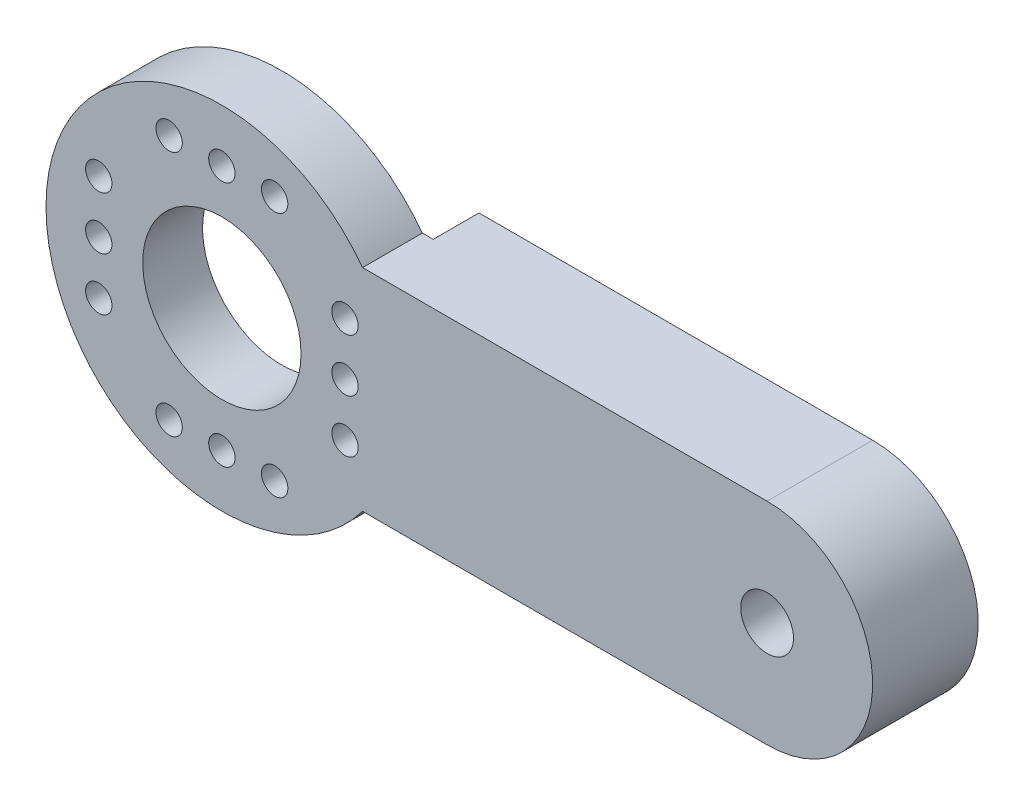
ISO-10303-21;
HEADER;
FILE_DESCRIPTION(('STEP AP214'),'2;1');
FILE_NAME('part.step','',(''),(''),'','','');
FILE_SCHEMA(('AUTOMOTIVE_DESIGN { 1 0 10303 214 1 1 1 1 }'));
ENDSEC;
DATA;
#1=APPLICATION_CONTEXT('core data for automotive mechanical design processes');
#2=APPLICATION_PROTOCOL_DEFINITION('international standard','automotive_design',2000,#1);
#3=PRODUCT_CONTEXT('',#1,'mechanical');
#4=PRODUCT('Part','Part','',(#3));
#5=PRODUCT_RELATED_PRODUCT_CATEGORY('part','',(#4));
#6=PRODUCT_DEFINITION_FORMATION('','',#4);
#7=PRODUCT_DEFINITION_CONTEXT('part definition',#1,'design');
#8=PRODUCT_DEFINITION('design','',#6,#7);
#9=PRODUCT_DEFINITION_SHAPE('','',#8);
#10=(LENGTH_UNIT() NAMED_UNIT(*) SI_UNIT(.MILLI.,.METRE.));
#11=(NAMED_UNIT(*) PLANE_ANGLE_UNIT() SI_UNIT($,.RADIAN.));
#12=(NAMED_UNIT(*) SI_UNIT($,.STERADIAN.) SOLID_ANGLE_UNIT());
#13=UNCERTAINTY_MEASURE_WITH_UNIT(LENGTH_MEASURE(1.E-05),#10,'distance_accuracy_value','');
#14=(GEOMETRIC_REPRESENTATION_CONTEXT(3) GLOBAL_UNCERTAINTY_ASSIGNED_CONTEXT((#13)) GLOBAL_UNIT_ASSIGNED_CONTEXT((#10,
#11,#12)) REPRESENTATION_CONTEXT('',''));
#15=CARTESIAN_POINT('',(0.,0.,0.));
#16=DIRECTION('',(0.,0.,1.));
#17=DIRECTION('',(1.,0.,0.));
#18=AXIS2_PLACEMENT_3D('',#15,#16,#17);
#19=CARTESIAN_POINT('',(0.,-77.386258364001,-6.));
#20=DIRECTION('',(0.,1.,0.));
#21=DIRECTION('',(-1.,0.,0.));
#22=AXIS2_PLACEMENT_3D('',#19,#20,#21);
#23=PLANE('',#22);
#24=DIRECTION('',(0.,0.,1.));
#25=VECTOR('',#24,1.);
#26=CARTESIAN_POINT('',(-4.43390628821608,-77.386258364001,-15.5));
#27=LINE('',#26,#25);
#28=CARTESIAN_POINT('',(-4.43390628821608,-77.386258364001,-6.));
#29=VERTEX_POINT('',#28);
#30=CARTESIAN_POINT('',(-4.43390628821608,-77.386258364001,-3.40000000000027));
#31=VERTEX_POINT('',#30);
#32=EDGE_CURVE('E118',#29,#31,#27,.T.);
#33=ORIENTED_EDGE('',*,*,#32,.F.);
#34=DIRECTION('',(-1.,0.,0.));
#35=VECTOR('',#34,1.);
#36=CARTESIAN_POINT('',(0.,-77.386258364001,-6.));
#37=LINE('',#36,#35);
#38=CARTESIAN_POINT('',(17.9492497419931,-77.386258364001,-6.));
#39=VERTEX_POINT('',#38);
#40=EDGE_CURVE('E84',#39,#29,#37,.T.);
#41=ORIENTED_EDGE('',*,*,#40,.F.);
#42=DIRECTION('',(0.,0.,1.));
#43=VECTOR('',#42,1.);
#44=CARTESIAN_POINT('',(17.9492497419931,-77.386258364001,-6.));
#45=LINE('',#44,#43);
#46=CARTESIAN_POINT('',(17.9492497419931,-77.386258364001,0.));
#47=VERTEX_POINT('',#46);
#48=EDGE_CURVE('E60',#39,#47,#45,.T.);
#49=ORIENTED_EDGE('',*,*,#48,.T.);
#50=DIRECTION('',(-1.,0.,0.));
#51=VECTOR('',#50,1.);
#52=CARTESIAN_POINT('',(0.,-77.386258364001,0.));
#53=LINE('',#52,#51);
#54=CARTESIAN_POINT('',(-5.05075025800691,-77.386258364001,0.));
#55=VERTEX_POINT('',#54);
#56=EDGE_CURVE('E81',#47,#55,#53,.T.);
#57=ORIENTED_EDGE('',*,*,#56,.T.);
#58=DIRECTION('',(0.,0.,1.));
#59=VECTOR('',#58,1.);
#60=CARTESIAN_POINT('',(-5.05075025800691,-77.386258364001,-6.));
#61=LINE('',#60,#59);
#62=CARTESIAN_POINT('',(-5.0507502580004,-77.3862583640059,-3.40000000000027));
#63=VERTEX_POINT('',#62);
#64=EDGE_CURVE('E86',#63,#55,#61,.T.);
#65=ORIENTED_EDGE('',*,*,#64,.F.);
#66=DIRECTION('',(1.,0.,0.));
#67=VECTOR('',#66,1.);
#68=CARTESIAN_POINT('',(0.,-77.386258364001,-3.40000000000027));
#69=LINE('',#68,#67);
#70=EDGE_CURVE('E126',#63,#31,#69,.T.);
#71=ORIENTED_EDGE('',*,*,#70,.T.);
#72=EDGE_LOOP('',(#33,#41,#49,#57,#65,#71));
#73=FACE_BOUND('',#72,.T.);
#74=ADVANCED_FACE('F36',(#73),#23,.F.);
#75=CARTESIAN_POINT('',(0.,-65.386258364001,-6.));
#76=DIRECTION('',(0.,-1.,0.));
#77=DIRECTION('',(1.,0.,0.));
#78=AXIS2_PLACEMENT_3D('',#75,#76,#77);
#79=PLANE('',#78);
#80=DIRECTION('',(0.,0.,1.));
#81=VECTOR('',#80,1.);
#82=CARTESIAN_POINT('',(-4.43390628823496,-65.386258364001,-15.5));
#83=LINE('',#82,#81);
#84=CARTESIAN_POINT('',(-4.43390628823497,-65.386258364001,-3.40000000000025));
#85=VERTEX_POINT('',#84);
#86=CARTESIAN_POINT('',(-4.43390628823497,-65.386258364001,-6.));
#87=VERTEX_POINT('',#86);
#88=EDGE_CURVE('E51',#85,#87,#83,.F.);
#89=ORIENTED_EDGE('',*,*,#88,.F.);
#90=DIRECTION('',(-1.,0.,0.));
#91=VECTOR('',#90,1.);
#92=CARTESIAN_POINT('',(0.,-65.386258364001,-3.40000000000025));
#93=LINE('',#92,#91);
#94=CARTESIAN_POINT('',(-5.05075025800691,-65.386258364001,-3.40000000000025));
#95=VERTEX_POINT('',#94);
#96=EDGE_CURVE('E11',#85,#95,#93,.T.);
#97=ORIENTED_EDGE('',*,*,#96,.T.);
#98=DIRECTION('',(0.,0.,1.));
#99=VECTOR('',#98,1.);
#100=CARTESIAN_POINT('',(-5.05075025800691,-65.386258364001,-6.));
#101=LINE('',#100,#99);
#102=CARTESIAN_POINT('',(-5.05075025800691,-65.386258364001,0.));
#103=VERTEX_POINT('',#102);
#104=EDGE_CURVE('E112',#95,#103,#101,.T.);
#105=ORIENTED_EDGE('',*,*,#104,.T.);
#106=DIRECTION('',(1.,0.,0.));
#107=VECTOR('',#106,1.);
#108=CARTESIAN_POINT('',(0.,-65.386258364001,0.));
#109=LINE('',#108,#107);
#110=CARTESIAN_POINT('',(17.9492497419931,-65.386258364001,0.));
#111=VERTEX_POINT('',#110);
#112=EDGE_CURVE('E100',#103,#111,#109,.T.);
#113=ORIENTED_EDGE('',*,*,#112,.T.);
#114=DIRECTION('',(0.,0.,1.));
#115=VECTOR('',#114,1.);
#116=CARTESIAN_POINT('',(17.9492497419931,-65.386258364001,-6.));
#117=LINE('',#116,#115);
#118=CARTESIAN_POINT('',(17.9492497419931,-65.386258364001,-6.));
#119=VERTEX_POINT('',#118);
#120=EDGE_CURVE('E98',#119,#111,#117,.T.);
#121=ORIENTED_EDGE('',*,*,#120,.F.);
#122=DIRECTION('',(1.,0.,0.));
#123=VECTOR('',#122,1.);
#124=CARTESIAN_POINT('',(0.,-65.386258364001,-6.));
#125=LINE('',#124,#123);
#126=EDGE_CURVE('E131',#87,#119,#125,.T.);
#127=ORIENTED_EDGE('',*,*,#126,.F.);
#128=EDGE_LOOP('',(#89,#97,#105,#113,#121,#127));
#129=FACE_BOUND('',#128,.T.);
#130=ADVANCED_FACE('F259',(#129),#79,.F.);
#131=CARTESIAN_POINT('',(17.9492497419931,-71.386258364001,-6.));
#132=DIRECTION('',(0.,0.,1.));
#133=DIRECTION('',(1.,0.,0.));
#134=AXIS2_PLACEMENT_3D('',#131,#132,#133);
#135=CYLINDRICAL_SURFACE('',#134,6.00000000000002);
#136=CARTESIAN_POINT('',(17.9492497419931,-71.386258364001,0.));
#137=DIRECTION('',(0.,0.,1.));
#138=DIRECTION('',(1.,0.,0.));
#139=AXIS2_PLACEMENT_3D('',#136,#137,#138);
#140=CIRCLE('',#139,6.00000000000002);
#141=EDGE_CURVE('E92',#47,#111,#140,.T.);
#142=ORIENTED_EDGE('',*,*,#141,.F.);
#143=ORIENTED_EDGE('',*,*,#48,.F.);
#144=CARTESIAN_POINT('',(17.9492497419931,-71.386258364001,-6.));
#145=DIRECTION('',(0.,0.,1.));
#146=DIRECTION('',(1.,0.,0.));
#147=AXIS2_PLACEMENT_3D('',#144,#145,#146);
#148=CIRCLE('',#147,6.00000000000002);
#149=EDGE_CURVE('E95',#39,#119,#148,.T.);
#150=ORIENTED_EDGE('',*,*,#149,.T.);
#151=ORIENTED_EDGE('',*,*,#120,.T.);
#152=EDGE_LOOP('',(#142,#143,#150,#151));
#153=FACE_BOUND('',#152,.T.);
#154=ADVANCED_FACE('F38',(#153),#135,.T.);
#155=CARTESIAN_POINT('',(-13.0507502580171,-71.3862583640146,-6.));
#156=DIRECTION('',(0.,0.,1.));
#157=DIRECTION('',(1.,0.,0.));
#158=AXIS2_PLACEMENT_3D('',#155,#156,#157);
#159=CYLINDRICAL_SURFACE('',#158,10.0000000000081);
#160=CARTESIAN_POINT('',(-13.0507502580171,-71.3862583640146,-3.40000000000026));
#161=DIRECTION('',(0.,0.,1.));
#162=DIRECTION('',(0.,-1.,0.));
#163=AXIS2_PLACEMENT_3D('',#160,#161,#162);
#164=CIRCLE('',#163,10.0000000000081);
#165=EDGE_CURVE('E127',#63,#95,#164,.F.);
#166=ORIENTED_EDGE('',*,*,#165,.F.);
#167=ORIENTED_EDGE('',*,*,#64,.T.);
#168=CARTESIAN_POINT('',(-13.0507502580171,-71.3862583640146,0.));
#169=DIRECTION('',(0.,0.,1.));
#170=DIRECTION('',(1.,0.,0.));
#171=AXIS2_PLACEMENT_3D('',#168,#169,#170);
#172=CIRCLE('',#171,10.0000000000081);
#173=EDGE_CURVE('E94',#103,#55,#172,.T.);
#174=ORIENTED_EDGE('',*,*,#173,.F.);
#175=ORIENTED_EDGE('',*,*,#104,.F.);
#176=EDGE_LOOP('',(#166,#167,#174,#175));
#177=FACE_BOUND('',#176,.T.);
#178=ADVANCED_FACE('F260',(#177),#159,.T.);
#179=CARTESIAN_POINT('',(0.,0.,-6.));
#180=DIRECTION('',(0.,0.,1.));
#181=DIRECTION('',(1.,0.,0.));
#182=AXIS2_PLACEMENT_3D('',#179,#180,#181);
#183=PLANE('',#182);
#184=CARTESIAN_POINT('',(-13.0507502580171,-71.3862583640146,-6.));
#185=DIRECTION('',(0.,0.,1.));
#186=DIRECTION('',(1.,0.,0.));
#187=AXIS2_PLACEMENT_3D('',#184,#185,#186);
#188=CIRCLE('',#187,10.4999999999873);
#189=EDGE_CURVE('E44',#87,#29,#188,.F.);
#190=ORIENTED_EDGE('',*,*,#189,.F.);
#191=ORIENTED_EDGE('',*,*,#126,.T.);
#192=ORIENTED_EDGE('',*,*,#149,.F.);
#193=ORIENTED_EDGE('',*,*,#40,.T.);
#194=EDGE_LOOP('',(#190,#191,#192,#193));
#195=FACE_BOUND('',#194,.T.);
#196=CARTESIAN_POINT('',(17.9492497419931,-71.386258364001,-6.));
#197=DIRECTION('',(0.,0.,1.));
#198=DIRECTION('',(1.,0.,0.));
#199=AXIS2_PLACEMENT_3D('',#196,#197,#198);
#200=CIRCLE('',#199,1.50000000000001);
#201=CARTESIAN_POINT('',(19.4492497419931,-71.386258364001,-6.));
#202=VERTEX_POINT('',#201);
#203=EDGE_CURVE('E101',#202,#202,#200,.T.);
#204=ORIENTED_EDGE('',*,*,#203,.T.);
#205=EDGE_LOOP('',(#204));
#206=FACE_BOUND('',#205,.T.);
#207=ADVANCED_FACE('F129',(#195,#206),#183,.F.);
#208=CARTESIAN_POINT('',(0.,0.,0.));
#209=DIRECTION('',(0.,0.,1.));
#210=DIRECTION('',(1.,0.,0.));
#211=AXIS2_PLACEMENT_3D('',#208,#209,#210);
#212=PLANE('',#211);
#213=CARTESIAN_POINT('',(-13.0507502580171,-71.3862583640146,0.));
#214=DIRECTION('',(0.,0.,1.));
#215=DIRECTION('',(1.,0.,0.));
#216=AXIS2_PLACEMENT_3D('',#213,#214,#215);
#217=CIRCLE('',#216,4.5);
#218=CARTESIAN_POINT('',(-8.55075025801707,-71.3862583640146,0.));
#219=VERTEX_POINT('',#218);
#220=EDGE_CURVE('E186',#219,#219,#217,.T.);
#221=ORIENTED_EDGE('',*,*,#220,.F.);
#222=EDGE_LOOP('',(#221));
#223=FACE_BOUND('',#222,.T.);
#224=CARTESIAN_POINT('',(-16.0507502579993,-64.3862583640001,0.));
#225=DIRECTION('',(0.,0.,1.));
#226=DIRECTION('',(1.,0.,0.));
#227=AXIS2_PLACEMENT_3D('',#224,#225,#226);
#228=CIRCLE('',#227,0.749999999999999);
#229=CARTESIAN_POINT('',(-15.3007502579993,-64.3862583640001,0.));
#230=VERTEX_POINT('',#229);
#231=EDGE_CURVE('E142',#230,#230,#228,.T.);
#232=ORIENTED_EDGE('',*,*,#231,.F.);
#233=EDGE_LOOP('',(#232));
#234=FACE_BOUND('',#233,.T.);
#235=CARTESIAN_POINT('',(-10.0507502579993,-64.3862583640001,0.));
#236=DIRECTION('',(0.,0.,1.));
#237=DIRECTION('',(1.,0.,0.));
#238=AXIS2_PLACEMENT_3D('',#235,#236,#237);
#239=CIRCLE('',#238,0.749999999999999);
#240=CARTESIAN_POINT('',(-9.30075025799929,-64.3862583640001,0.));
#241=VERTEX_POINT('',#240);
#242=EDGE_CURVE('E145',#241,#241,#239,.T.);
#243=ORIENTED_EDGE('',*,*,#242,.F.);
#244=EDGE_LOOP('',(#243));
#245=FACE_BOUND('',#244,.T.);
#246=CARTESIAN_POINT('',(-13.0507502579993,-64.3862583640001,0.));
#247=DIRECTION('',(0.,0.,1.));
#248=DIRECTION('',(1.,0.,0.));
#249=AXIS2_PLACEMENT_3D('',#246,#247,#248);
#250=CIRCLE('',#249,0.749999999999999);
#251=CARTESIAN_POINT('',(-12.3007502579993,-64.3862583640001,0.));
#252=VERTEX_POINT('',#251);
#253=EDGE_CURVE('E148',#252,#252,#250,.T.);
#254=ORIENTED_EDGE('',*,*,#253,.F.);
#255=EDGE_LOOP('',(#254));
#256=FACE_BOUND('',#255,.T.);
#257=CARTESIAN_POINT('',(-6.05075025799934,-74.3862583640001,0.));
#258=DIRECTION('',(0.,0.,1.));
#259=DIRECTION('',(1.,0.,0.));
#260=AXIS2_PLACEMENT_3D('',#257,#258,#259);
#261=CIRCLE('',#260,0.750000000000003);
#262=CARTESIAN_POINT('',(-5.30075025799934,-74.3862583640001,0.));
#263=VERTEX_POINT('',#262);
#264=EDGE_CURVE('E151',#263,#263,#261,.T.);
#265=ORIENTED_EDGE('',*,*,#264,.F.);
#266=EDGE_LOOP('',(#265));
#267=FACE_BOUND('',#266,.T.);
#268=CARTESIAN_POINT('',(-6.05075025799935,-68.3862583640001,0.));
#269=DIRECTION('',(0.,0.,1.));
#270=DIRECTION('',(1.,0.,0.));
#271=AXIS2_PLACEMENT_3D('',#268,#269,#270);
#272=CIRCLE('',#271,0.749999999999999);
#273=CARTESIAN_POINT('',(-5.30075025799935,-68.3862583640001,0.));
#274=VERTEX_POINT('',#273);
#275=EDGE_CURVE('E154',#274,#274,#272,.T.);
#276=ORIENTED_EDGE('',*,*,#275,.F.);
#277=EDGE_LOOP('',(#276));
#278=FACE_BOUND('',#277,.T.);
#279=CARTESIAN_POINT('',(-13.0507502579993,-78.3862583640001,0.));
#280=DIRECTION('',(0.,0.,1.));
#281=DIRECTION('',(1.,0.,0.));
#282=AXIS2_PLACEMENT_3D('',#279,#280,#281);
#283=CIRCLE('',#282,0.750000000000012);
#284=CARTESIAN_POINT('',(-12.3007502579993,-78.3862583640001,0.));
#285=VERTEX_POINT('',#284);
#286=EDGE_CURVE('E157',#285,#285,#283,.T.);
#287=ORIENTED_EDGE('',*,*,#286,.F.);
#288=EDGE_LOOP('',(#287));
#289=FACE_BOUND('',#288,.T.);
#290=CARTESIAN_POINT('',(-16.0507502579993,-78.3862583640001,0.));
#291=DIRECTION('',(0.,0.,1.));
#292=DIRECTION('',(1.,0.,0.));
#293=AXIS2_PLACEMENT_3D('',#290,#291,#292);
#294=CIRCLE('',#293,0.749999999999999);
#295=CARTESIAN_POINT('',(-15.3007502579993,-78.3862583640001,0.));
#296=VERTEX_POINT('',#295);
#297=EDGE_CURVE('E160',#296,#296,#294,.T.);
#298=ORIENTED_EDGE('',*,*,#297,.F.);
#299=EDGE_LOOP('',(#298));
#300=FACE_BOUND('',#299,.T.);
#301=CARTESIAN_POINT('',(-20.0507502579994,-74.3862583640001,0.));
#302=DIRECTION('',(0.,0.,1.));
#303=DIRECTION('',(1.,0.,0.));
#304=AXIS2_PLACEMENT_3D('',#301,#302,#303);
#305=CIRCLE('',#304,0.749999999999999);
#306=CARTESIAN_POINT('',(-19.3007502579994,-74.3862583640001,0.));
#307=VERTEX_POINT('',#306);
#308=EDGE_CURVE('E163',#307,#307,#305,.T.);
#309=ORIENTED_EDGE('',*,*,#308,.F.);
#310=EDGE_LOOP('',(#309));
#311=FACE_BOUND('',#310,.T.);
#312=CARTESIAN_POINT('',(-20.0507502579993,-68.3862583640001,0.));
#313=DIRECTION('',(0.,0.,1.));
#314=DIRECTION('',(1.,0.,0.));
#315=AXIS2_PLACEMENT_3D('',#312,#313,#314);
#316=CIRCLE('',#315,0.749999999999999);
#317=CARTESIAN_POINT('',(-19.3007502579993,-68.3862583640001,0.));
#318=VERTEX_POINT('',#317);
#319=EDGE_CURVE('E166',#318,#318,#316,.T.);
#320=ORIENTED_EDGE('',*,*,#319,.F.);
#321=EDGE_LOOP('',(#320));
#322=FACE_BOUND('',#321,.T.);
#323=CARTESIAN_POINT('',(-20.0507502579994,-71.3862583640001,0.));
#324=DIRECTION('',(0.,0.,1.));
#325=DIRECTION('',(1.,0.,0.));
#326=AXIS2_PLACEMENT_3D('',#323,#324,#325);
#327=CIRCLE('',#326,0.749999999999999);
#328=CARTESIAN_POINT('',(-19.3007502579994,-71.3862583640001,0.));
#329=VERTEX_POINT('',#328);
#330=EDGE_CURVE('E169',#329,#329,#327,.T.);
#331=ORIENTED_EDGE('',*,*,#330,.F.);
#332=EDGE_LOOP('',(#331));
#333=FACE_BOUND('',#332,.T.);
#334=CARTESIAN_POINT('',(-10.0507502579993,-78.3862583640001,0.));
#335=DIRECTION('',(0.,0.,1.));
#336=DIRECTION('',(1.,0.,0.));
#337=AXIS2_PLACEMENT_3D('',#334,#335,#336);
#338=CIRCLE('',#337,0.749999999999999);
#339=CARTESIAN_POINT('',(-9.30075025799934,-78.3862583640001,0.));
#340=VERTEX_POINT('',#339);
#341=EDGE_CURVE('E172',#340,#340,#338,.T.);
#342=ORIENTED_EDGE('',*,*,#341,.F.);
#343=EDGE_LOOP('',(#342));
#344=FACE_BOUND('',#343,.T.);
#345=CARTESIAN_POINT('',(-6.05075025799934,-71.3862583640001,0.));
#346=DIRECTION('',(0.,0.,1.));
#347=DIRECTION('',(1.,0.,0.));
#348=AXIS2_PLACEMENT_3D('',#345,#346,#347);
#349=CIRCLE('',#348,0.75);
#350=CARTESIAN_POINT('',(-5.30075025799934,-71.3862583640001,0.));
#351=VERTEX_POINT('',#350);
#352=EDGE_CURVE('E175',#351,#351,#349,.T.);
#353=ORIENTED_EDGE('',*,*,#352,.F.);
#354=EDGE_LOOP('',(#353));
#355=FACE_BOUND('',#354,.T.);
#356=CARTESIAN_POINT('',(17.9492497419931,-71.386258364001,0.));
#357=DIRECTION('',(0.,0.,1.));
#358=DIRECTION('',(1.,0.,0.));
#359=AXIS2_PLACEMENT_3D('',#356,#357,#358);
#360=CIRCLE('',#359,1.50000000000001);
#361=CARTESIAN_POINT('',(19.4492497419931,-71.386258364001,0.));
#362=VERTEX_POINT('',#361);
#363=EDGE_CURVE('E105',#362,#362,#360,.T.);
#364=ORIENTED_EDGE('',*,*,#363,.F.);
#365=EDGE_LOOP('',(#364));
#366=FACE_BOUND('',#365,.T.);
#367=ORIENTED_EDGE('',*,*,#141,.T.);
#368=ORIENTED_EDGE('',*,*,#112,.F.);
#369=ORIENTED_EDGE('',*,*,#173,.T.);
#370=ORIENTED_EDGE('',*,*,#56,.F.);
#371=EDGE_LOOP('',(#367,#368,#369,#370));
#372=FACE_BOUND('',#371,.T.);
#373=ADVANCED_FACE('F90',(#223,#234,#245,#256,#267,#278,#289,#300,#311,#322,#333,#344,#355,#366,
#372),#212,.T.);
#374=CARTESIAN_POINT('',(17.9492497419931,-71.386258364001,-31.));
#375=DIRECTION('',(0.,0.,1.));
#376=DIRECTION('',(1.,0.,0.));
#377=AXIS2_PLACEMENT_3D('',#374,#375,#376);
#378=CYLINDRICAL_SURFACE('',#377,1.50000000000001);
#379=ORIENTED_EDGE('',*,*,#363,.T.);
#380=EDGE_LOOP('',(#379));
#381=FACE_BOUND('',#380,.T.);
#382=ORIENTED_EDGE('',*,*,#203,.F.);
#383=EDGE_LOOP('',(#382));
#384=FACE_BOUND('',#383,.T.);
#385=ADVANCED_FACE('F226',(#381,#384),#378,.F.);
#386=CARTESIAN_POINT('',(-13.0507502579995,-71.3862583640001,-3.40000000000026));
#387=DIRECTION('',(0.,0.,1.));
#388=DIRECTION('',(1.,0.,0.));
#389=AXIS2_PLACEMENT_3D('',#386,#387,#388);
#390=PLANE('',#389);
#391=CARTESIAN_POINT('',(-13.0507502580171,-71.3862583640146,-3.40000000000026));
#392=DIRECTION('',(0.,0.,-1.));
#393=DIRECTION('',(0.,1.,0.));
#394=AXIS2_PLACEMENT_3D('',#391,#392,#393);
#395=CIRCLE('',#394,4.5);
#396=CARTESIAN_POINT('',(-13.0507502580171,-66.8862583640146,-3.40000000000025));
#397=VERTEX_POINT('',#396);
#398=EDGE_CURVE('E217',#397,#397,#395,.T.);
#399=ORIENTED_EDGE('',*,*,#398,.F.);
#400=EDGE_LOOP('',(#399));
#401=FACE_BOUND('',#400,.T.);
#402=CARTESIAN_POINT('',(-16.0507502579993,-64.3862583640001,-3.40000000000025));
#403=DIRECTION('',(0.,0.,-1.));
#404=DIRECTION('',(0.,1.,0.));
#405=AXIS2_PLACEMENT_3D('',#402,#403,#404);
#406=CIRCLE('',#405,0.749999999999999);
#407=CARTESIAN_POINT('',(-16.0507502579993,-63.6362583640001,-3.40000000000025));
#408=VERTEX_POINT('',#407);
#409=EDGE_CURVE('E182',#408,#408,#406,.T.);
#410=ORIENTED_EDGE('',*,*,#409,.F.);
#411=EDGE_LOOP('',(#410));
#412=FACE_BOUND('',#411,.T.);
#413=CARTESIAN_POINT('',(-10.0507502579993,-64.3862583640001,-3.40000000000025));
#414=DIRECTION('',(0.,0.,-1.));
#415=DIRECTION('',(0.,1.,0.));
#416=AXIS2_PLACEMENT_3D('',#413,#414,#415);
#417=CIRCLE('',#416,0.749999999999999);
#418=CARTESIAN_POINT('',(-10.0507502579993,-63.6362583640001,-3.40000000000025));
#419=VERTEX_POINT('',#418);
#420=EDGE_CURVE('E185',#419,#419,#417,.T.);
#421=ORIENTED_EDGE('',*,*,#420,.F.);
#422=EDGE_LOOP('',(#421));
#423=FACE_BOUND('',#422,.T.);
#424=CARTESIAN_POINT('',(-13.0507502579993,-64.3862583640001,-3.40000000000025));
#425=DIRECTION('',(0.,0.,-1.));
#426=DIRECTION('',(0.,1.,0.));
#427=AXIS2_PLACEMENT_3D('',#424,#425,#426);
#428=CIRCLE('',#427,0.749999999999999);
#429=CARTESIAN_POINT('',(-13.0507502579993,-63.6362583640001,-3.40000000000025));
#430=VERTEX_POINT('',#429);
#431=EDGE_CURVE('E189',#430,#430,#428,.T.);
#432=ORIENTED_EDGE('',*,*,#431,.F.);
#433=EDGE_LOOP('',(#432));
#434=FACE_BOUND('',#433,.T.);
#435=CARTESIAN_POINT('',(-6.05075025799934,-74.3862583640001,-3.40000000000027));
#436=DIRECTION('',(0.,0.,-1.));
#437=DIRECTION('',(0.,1.,0.));
#438=AXIS2_PLACEMENT_3D('',#435,#436,#437);
#439=CIRCLE('',#438,0.750000000000003);
#440=CARTESIAN_POINT('',(-6.05075025799934,-73.6362583640001,-3.40000000000026));
#441=VERTEX_POINT('',#440);
#442=EDGE_CURVE('E181',#441,#441,#439,.T.);
#443=ORIENTED_EDGE('',*,*,#442,.F.);
#444=EDGE_LOOP('',(#443));
#445=FACE_BOUND('',#444,.T.);
#446=CARTESIAN_POINT('',(-6.05075025799935,-68.3862583640001,-3.40000000000025));
#447=DIRECTION('',(0.,0.,-1.));
#448=DIRECTION('',(0.,1.,0.));
#449=AXIS2_PLACEMENT_3D('',#446,#447,#448);
#450=CIRCLE('',#449,0.749999999999999);
#451=CARTESIAN_POINT('',(-6.05075025799935,-67.6362583640001,-3.40000000000025));
#452=VERTEX_POINT('',#451);
#453=EDGE_CURVE('E200',#452,#452,#450,.T.);
#454=ORIENTED_EDGE('',*,*,#453,.F.);
#455=EDGE_LOOP('',(#454));
#456=FACE_BOUND('',#455,.T.);
#457=CARTESIAN_POINT('',(-13.0507502579993,-78.3862583640001,-3.40000000000027));
#458=DIRECTION('',(0.,0.,-1.));
#459=DIRECTION('',(0.,1.,0.));
#460=AXIS2_PLACEMENT_3D('',#457,#458,#459);
#461=CIRCLE('',#460,0.750000000000012);
#462=CARTESIAN_POINT('',(-13.0507502579993,-77.6362583640001,-3.40000000000027));
#463=VERTEX_POINT('',#462);
#464=EDGE_CURVE('E196',#463,#463,#461,.T.);
#465=ORIENTED_EDGE('',*,*,#464,.F.);
#466=EDGE_LOOP('',(#465));
#467=FACE_BOUND('',#466,.T.);
#468=CARTESIAN_POINT('',(-16.0507502579993,-78.3862583640001,-3.40000000000027));
#469=DIRECTION('',(0.,0.,-1.));
#470=DIRECTION('',(0.,1.,0.));
#471=AXIS2_PLACEMENT_3D('',#468,#469,#470);
#472=CIRCLE('',#471,0.749999999999999);
#473=CARTESIAN_POINT('',(-16.0507502579993,-77.6362583640001,-3.40000000000027));
#474=VERTEX_POINT('',#473);
#475=EDGE_CURVE('E193',#474,#474,#472,.T.);
#476=ORIENTED_EDGE('',*,*,#475,.F.);
#477=EDGE_LOOP('',(#476));
#478=FACE_BOUND('',#477,.T.);
#479=CARTESIAN_POINT('',(-20.0507502579994,-74.3862583640001,-3.40000000000027));
#480=DIRECTION('',(0.,0.,-1.));
#481=DIRECTION('',(0.,1.,0.));
#482=AXIS2_PLACEMENT_3D('',#479,#480,#481);
#483=CIRCLE('',#482,0.749999999999999);
#484=CARTESIAN_POINT('',(-20.0507502579994,-73.6362583640001,-3.40000000000026));
#485=VERTEX_POINT('',#484);
#486=EDGE_CURVE('E192',#485,#485,#483,.T.);
#487=ORIENTED_EDGE('',*,*,#486,.F.);
#488=EDGE_LOOP('',(#487));
#489=FACE_BOUND('',#488,.T.);
#490=CARTESIAN_POINT('',(-20.0507502579993,-68.3862583640001,-3.40000000000025));
#491=DIRECTION('',(0.,0.,-1.));
#492=DIRECTION('',(0.,1.,0.));
#493=AXIS2_PLACEMENT_3D('',#490,#491,#492);
#494=CIRCLE('',#493,0.749999999999999);
#495=CARTESIAN_POINT('',(-20.0507502579993,-67.6362583640001,-3.40000000000025));
#496=VERTEX_POINT('',#495);
#497=EDGE_CURVE('E208',#496,#496,#494,.T.);
#498=ORIENTED_EDGE('',*,*,#497,.F.);
#499=EDGE_LOOP('',(#498));
#500=FACE_BOUND('',#499,.T.);
#501=CARTESIAN_POINT('',(-20.0507502579994,-71.3862583640001,-3.40000000000026));
#502=DIRECTION('',(0.,0.,-1.));
#503=DIRECTION('',(0.,1.,0.));
#504=AXIS2_PLACEMENT_3D('',#501,#502,#503);
#505=CIRCLE('',#504,0.749999999999999);
#506=CARTESIAN_POINT('',(-20.0507502579994,-70.6362583640001,-3.40000000000026));
#507=VERTEX_POINT('',#506);
#508=EDGE_CURVE('E205',#507,#507,#505,.T.);
#509=ORIENTED_EDGE('',*,*,#508,.F.);
#510=EDGE_LOOP('',(#509));
#511=FACE_BOUND('',#510,.T.);
#512=CARTESIAN_POINT('',(-10.0507502579993,-78.3862583640001,-3.40000000000027));
#513=DIRECTION('',(0.,0.,-1.));
#514=DIRECTION('',(0.,1.,0.));
#515=AXIS2_PLACEMENT_3D('',#512,#513,#514);
#516=CIRCLE('',#515,0.749999999999999);
#517=CARTESIAN_POINT('',(-10.0507502579993,-77.6362583640001,-3.40000000000027));
#518=VERTEX_POINT('',#517);
#519=EDGE_CURVE('E197',#518,#518,#516,.T.);
#520=ORIENTED_EDGE('',*,*,#519,.F.);
#521=EDGE_LOOP('',(#520));
#522=FACE_BOUND('',#521,.T.);
#523=CARTESIAN_POINT('',(-6.05075025799934,-71.3862583640001,-3.40000000000026));
#524=DIRECTION('',(0.,0.,-1.));
#525=DIRECTION('',(0.,1.,0.));
#526=AXIS2_PLACEMENT_3D('',#523,#524,#525);
#527=CIRCLE('',#526,0.75);
#528=CARTESIAN_POINT('',(-6.05075025799934,-70.6362583640001,-3.40000000000026));
#529=VERTEX_POINT('',#528);
#530=EDGE_CURVE('E178',#529,#529,#527,.T.);
#531=ORIENTED_EDGE('',*,*,#530,.F.);
#532=EDGE_LOOP('',(#531));
#533=FACE_BOUND('',#532,.T.);
#534=ORIENTED_EDGE('',*,*,#165,.T.);
#535=ORIENTED_EDGE('',*,*,#96,.F.);
#536=CARTESIAN_POINT('',(-13.0507502580171,-71.3862583640146,-3.40000000000026));
#537=DIRECTION('',(0.,0.,1.));
#538=DIRECTION('',(0.,-1.,0.));
#539=AXIS2_PLACEMENT_3D('',#536,#537,#538);
#540=CIRCLE('',#539,10.4999999999873);
#541=EDGE_CURVE('E140',#85,#31,#540,.F.);
#542=ORIENTED_EDGE('',*,*,#541,.T.);
#543=ORIENTED_EDGE('',*,*,#70,.F.);
#544=EDGE_LOOP('',(#534,#535,#542,#543));
#545=FACE_BOUND('',#544,.T.);
#546=ADVANCED_FACE('F223',(#401,#412,#423,#434,#445,#456,#467,#478,#489,#500,#511,#522,#533,
#545),#390,.F.);
#547=CARTESIAN_POINT('',(-13.0507502580171,-71.3862583640146,-15.5));
#548=DIRECTION('',(0.,0.,1.));
#549=DIRECTION('',(1.,0.,0.));
#550=AXIS2_PLACEMENT_3D('',#547,#548,#549);
#551=CYLINDRICAL_SURFACE('',#550,10.4999999999873);
#552=ORIENTED_EDGE('',*,*,#32,.T.);
#553=ORIENTED_EDGE('',*,*,#541,.F.);
#554=ORIENTED_EDGE('',*,*,#88,.T.);
#555=ORIENTED_EDGE('',*,*,#189,.T.);
#556=EDGE_LOOP('',(#552,#553,#554,#555));
#557=FACE_BOUND('',#556,.T.);
#558=ADVANCED_FACE('F116',(#557),#551,.F.);
#559=CARTESIAN_POINT('',(-6.05075025799934,-71.3862583640001,6.59999999999974));
#560=DIRECTION('',(0.,0.,-1.));
#561=DIRECTION('',(0.,1.,0.));
#562=AXIS2_PLACEMENT_3D('',#559,#560,#561);
#563=CYLINDRICAL_SURFACE('',#562,0.75);
#564=ORIENTED_EDGE('',*,*,#352,.T.);
#565=EDGE_LOOP('',(#564));
#566=FACE_BOUND('',#565,.T.);
#567=ORIENTED_EDGE('',*,*,#530,.T.);
#568=EDGE_LOOP('',(#567));
#569=FACE_BOUND('',#568,.T.);
#570=ADVANCED_FACE('F283',(#566,#569),#563,.F.);
#571=CARTESIAN_POINT('',(-10.0507502579993,-78.3862583640001,6.59999999999973));
#572=DIRECTION('',(0.,0.,-1.));
#573=DIRECTION('',(0.,1.,0.));
#574=AXIS2_PLACEMENT_3D('',#571,#572,#573);
#575=CYLINDRICAL_SURFACE('',#574,0.749999999999999);
#576=ORIENTED_EDGE('',*,*,#341,.T.);
#577=EDGE_LOOP('',(#576));
#578=FACE_BOUND('',#577,.T.);
#579=ORIENTED_EDGE('',*,*,#519,.T.);
#580=EDGE_LOOP('',(#579));
#581=FACE_BOUND('',#580,.T.);
#582=ADVANCED_FACE('F287',(#578,#581),#575,.F.);
#583=CARTESIAN_POINT('',(-20.0507502579994,-71.3862583640001,6.59999999999974));
#584=DIRECTION('',(0.,0.,-1.));
#585=DIRECTION('',(0.,1.,0.));
#586=AXIS2_PLACEMENT_3D('',#583,#584,#585);
#587=CYLINDRICAL_SURFACE('',#586,0.749999999999999);
#588=ORIENTED_EDGE('',*,*,#330,.T.);
#589=EDGE_LOOP('',(#588));
#590=FACE_BOUND('',#589,.T.);
#591=ORIENTED_EDGE('',*,*,#508,.T.);
#592=EDGE_LOOP('',(#591));
#593=FACE_BOUND('',#592,.T.);
#594=ADVANCED_FACE('F318',(#590,#593),#587,.F.);
#595=CARTESIAN_POINT('',(-20.0507502579993,-68.3862583640001,6.59999999999974));
#596=DIRECTION('',(0.,0.,-1.));
#597=DIRECTION('',(0.,1.,0.));
#598=AXIS2_PLACEMENT_3D('',#595,#596,#597);
#599=CYLINDRICAL_SURFACE('',#598,0.749999999999999);
#600=ORIENTED_EDGE('',*,*,#319,.T.);
#601=EDGE_LOOP('',(#600));
#602=FACE_BOUND('',#601,.T.);
#603=ORIENTED_EDGE('',*,*,#497,.T.);
#604=EDGE_LOOP('',(#603));
#605=FACE_BOUND('',#604,.T.);
#606=ADVANCED_FACE('F321',(#602,#605),#599,.F.);
#607=CARTESIAN_POINT('',(-20.0507502579994,-74.3862583640001,6.59999999999973));
#608=DIRECTION('',(0.,0.,-1.));
#609=DIRECTION('',(0.,1.,0.));
#610=AXIS2_PLACEMENT_3D('',#607,#608,#609);
#611=CYLINDRICAL_SURFACE('',#610,0.749999999999999);
#612=ORIENTED_EDGE('',*,*,#308,.T.);
#613=EDGE_LOOP('',(#612));
#614=FACE_BOUND('',#613,.T.);
#615=ORIENTED_EDGE('',*,*,#486,.T.);
#616=EDGE_LOOP('',(#615));
#617=FACE_BOUND('',#616,.T.);
#618=ADVANCED_FACE('F306',(#614,#617),#611,.F.);
#619=CARTESIAN_POINT('',(-16.0507502579993,-78.3862583640001,6.59999999999973));
#620=DIRECTION('',(0.,0.,-1.));
#621=DIRECTION('',(0.,1.,0.));
#622=AXIS2_PLACEMENT_3D('',#619,#620,#621);
#623=CYLINDRICAL_SURFACE('',#622,0.749999999999999);
#624=ORIENTED_EDGE('',*,*,#297,.T.);
#625=EDGE_LOOP('',(#624));
#626=FACE_BOUND('',#625,.T.);
#627=ORIENTED_EDGE('',*,*,#475,.T.);
#628=EDGE_LOOP('',(#627));
#629=FACE_BOUND('',#628,.T.);
#630=ADVANCED_FACE('F302',(#626,#629),#623,.F.);
#631=CARTESIAN_POINT('',(-13.0507502579993,-78.3862583640001,6.59999999999973));
#632=DIRECTION('',(0.,0.,-1.));
#633=DIRECTION('',(0.,1.,0.));
#634=AXIS2_PLACEMENT_3D('',#631,#632,#633);
#635=CYLINDRICAL_SURFACE('',#634,0.750000000000012);
#636=ORIENTED_EDGE('',*,*,#286,.T.);
#637=EDGE_LOOP('',(#636));
#638=FACE_BOUND('',#637,.T.);
#639=ORIENTED_EDGE('',*,*,#464,.T.);
#640=EDGE_LOOP('',(#639));
#641=FACE_BOUND('',#640,.T.);
#642=ADVANCED_FACE('F305',(#638,#641),#635,.F.);
#643=CARTESIAN_POINT('',(-6.05075025799935,-68.3862583640001,6.59999999999974));
#644=DIRECTION('',(0.,0.,-1.));
#645=DIRECTION('',(0.,1.,0.));
#646=AXIS2_PLACEMENT_3D('',#643,#644,#645);
#647=CYLINDRICAL_SURFACE('',#646,0.749999999999999);
#648=ORIENTED_EDGE('',*,*,#275,.T.);
#649=EDGE_LOOP('',(#648));
#650=FACE_BOUND('',#649,.T.);
#651=ORIENTED_EDGE('',*,*,#453,.T.);
#652=EDGE_LOOP('',(#651));
#653=FACE_BOUND('',#652,.T.);
#654=ADVANCED_FACE('F310',(#650,#653),#647,.F.);
#655=CARTESIAN_POINT('',(-6.05075025799934,-74.3862583640001,6.59999999999973));
#656=DIRECTION('',(0.,0.,-1.));
#657=DIRECTION('',(0.,1.,0.));
#658=AXIS2_PLACEMENT_3D('',#655,#656,#657);
#659=CYLINDRICAL_SURFACE('',#658,0.750000000000003);
#660=ORIENTED_EDGE('',*,*,#264,.T.);
#661=EDGE_LOOP('',(#660));
#662=FACE_BOUND('',#661,.T.);
#663=ORIENTED_EDGE('',*,*,#442,.T.);
#664=EDGE_LOOP('',(#663));
#665=FACE_BOUND('',#664,.T.);
#666=ADVANCED_FACE('F300',(#662,#665),#659,.F.);
#667=CARTESIAN_POINT('',(-13.0507502579993,-64.3862583640001,6.59999999999975));
#668=DIRECTION('',(0.,0.,-1.));
#669=DIRECTION('',(0.,1.,0.));
#670=AXIS2_PLACEMENT_3D('',#667,#668,#669);
#671=CYLINDRICAL_SURFACE('',#670,0.749999999999999);
#672=ORIENTED_EDGE('',*,*,#253,.T.);
#673=EDGE_LOOP('',(#672));
#674=FACE_BOUND('',#673,.T.);
#675=ORIENTED_EDGE('',*,*,#431,.T.);
#676=EDGE_LOOP('',(#675));
#677=FACE_BOUND('',#676,.T.);
#678=ADVANCED_FACE('F296',(#674,#677),#671,.F.);
#679=CARTESIAN_POINT('',(-10.0507502579993,-64.3862583640001,6.59999999999975));
#680=DIRECTION('',(0.,0.,-1.));
#681=DIRECTION('',(0.,1.,0.));
#682=AXIS2_PLACEMENT_3D('',#679,#680,#681);
#683=CYLINDRICAL_SURFACE('',#682,0.749999999999999);
#684=ORIENTED_EDGE('',*,*,#242,.T.);
#685=EDGE_LOOP('',(#684));
#686=FACE_BOUND('',#685,.T.);
#687=ORIENTED_EDGE('',*,*,#420,.T.);
#688=EDGE_LOOP('',(#687));
#689=FACE_BOUND('',#688,.T.);
#690=ADVANCED_FACE('F292',(#686,#689),#683,.F.);
#691=CARTESIAN_POINT('',(-16.0507502579993,-64.3862583640001,6.59999999999975));
#692=DIRECTION('',(0.,0.,-1.));
#693=DIRECTION('',(0.,1.,0.));
#694=AXIS2_PLACEMENT_3D('',#691,#692,#693);
#695=CYLINDRICAL_SURFACE('',#694,0.749999999999999);
#696=ORIENTED_EDGE('',*,*,#231,.T.);
#697=EDGE_LOOP('',(#696));
#698=FACE_BOUND('',#697,.T.);
#699=ORIENTED_EDGE('',*,*,#409,.T.);
#700=EDGE_LOOP('',(#699));
#701=FACE_BOUND('',#700,.T.);
#702=ADVANCED_FACE('F289',(#698,#701),#695,.F.);
#703=CARTESIAN_POINT('',(-13.0507502580171,-71.3862583640146,6.59999999999974));
#704=DIRECTION('',(0.,0.,-1.));
#705=DIRECTION('',(0.,1.,0.));
#706=AXIS2_PLACEMENT_3D('',#703,#704,#705);
#707=CYLINDRICAL_SURFACE('',#706,4.5);
#708=ORIENTED_EDGE('',*,*,#220,.T.);
#709=EDGE_LOOP('',(#708));
#710=FACE_BOUND('',#709,.T.);
#711=ORIENTED_EDGE('',*,*,#398,.T.);
#712=EDGE_LOOP('',(#711));
#713=FACE_BOUND('',#712,.T.);
#714=ADVANCED_FACE('F221',(#710,#713),#707,.F.);
#715=CLOSED_SHELL('',(#74,#130,#154,#178,#207,#373,#385,#546,#558,#570,#582,#594,#606,#618,#630,
#642,#654,#666,#678,#690,#702,#714));
#716=MANIFOLD_SOLID_BREP('B2',#715);
#717=ADVANCED_BREP_SHAPE_REPRESENTATION('',(#18,#716),#14);
#718=SHAPE_DEFINITION_REPRESENTATION(#9,#717);
ENDSEC;
END-ISO-10303-21;
